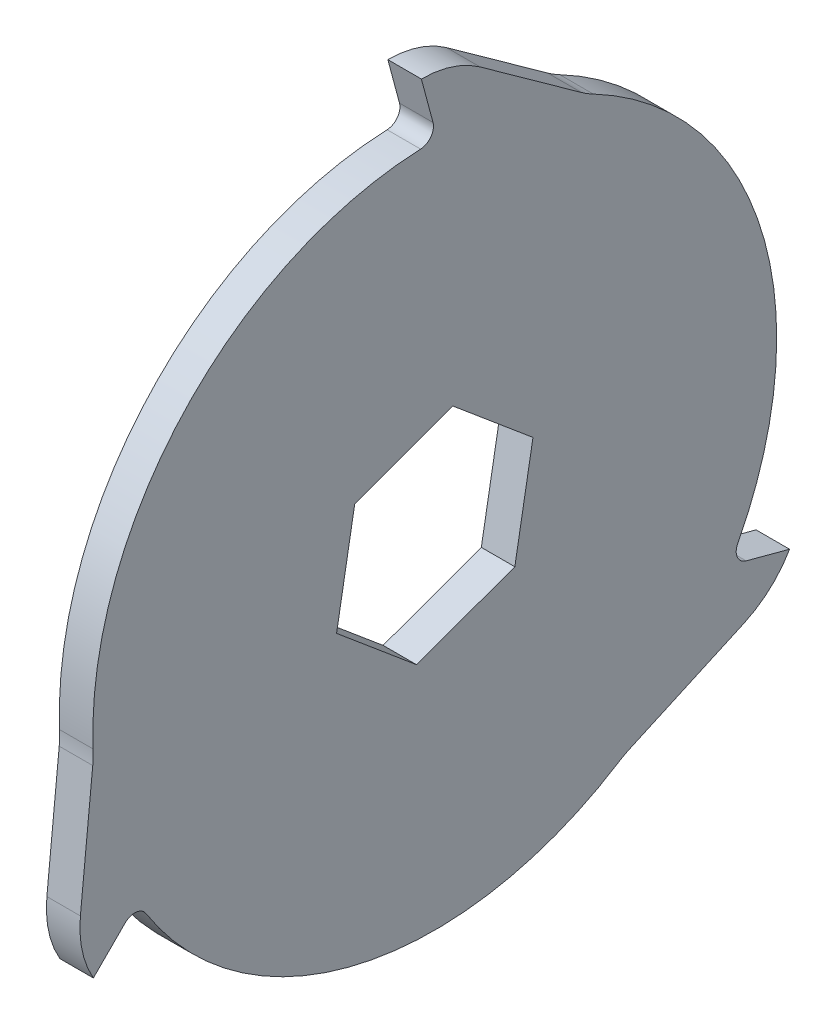
ISO-10303-21;
HEADER;
FILE_DESCRIPTION(('STEP AP214'),'2;1');
FILE_NAME('part.step','',(''),(''),'','','');
FILE_SCHEMA(('AUTOMOTIVE_DESIGN { 1 0 10303 214 1 1 1 1 }'));
ENDSEC;
DATA;
#1=APPLICATION_CONTEXT('core data for automotive mechanical design processes');
#2=APPLICATION_PROTOCOL_DEFINITION('international standard','automotive_design',2000,#1);
#3=PRODUCT_CONTEXT('',#1,'mechanical');
#4=PRODUCT('Part','Part','',(#3));
#5=PRODUCT_RELATED_PRODUCT_CATEGORY('part','',(#4));
#6=PRODUCT_DEFINITION_FORMATION('','',#4);
#7=PRODUCT_DEFINITION_CONTEXT('part definition',#1,'design');
#8=PRODUCT_DEFINITION('design','',#6,#7);
#9=PRODUCT_DEFINITION_SHAPE('','',#8);
#10=(LENGTH_UNIT() NAMED_UNIT(*) SI_UNIT(.MILLI.,.METRE.));
#11=(NAMED_UNIT(*) PLANE_ANGLE_UNIT() SI_UNIT($,.RADIAN.));
#12=(NAMED_UNIT(*) SI_UNIT($,.STERADIAN.) SOLID_ANGLE_UNIT());
#13=UNCERTAINTY_MEASURE_WITH_UNIT(LENGTH_MEASURE(1.E-05),#10,'distance_accuracy_value','');
#14=(GEOMETRIC_REPRESENTATION_CONTEXT(3) GLOBAL_UNCERTAINTY_ASSIGNED_CONTEXT((#13)) GLOBAL_UNIT_ASSIGNED_CONTEXT((#10,
#11,#12)) REPRESENTATION_CONTEXT('',''));
#15=CARTESIAN_POINT('',(0.,0.,0.));
#16=DIRECTION('',(0.,0.,1.));
#17=DIRECTION('',(1.,0.,0.));
#18=AXIS2_PLACEMENT_3D('',#15,#16,#17);
#19=CARTESIAN_POINT('',(2.5,0.,0.));
#20=DIRECTION('',(-1.,0.,0.));
#21=DIRECTION('',(0.,0.,1.));
#22=AXIS2_PLACEMENT_3D('',#19,#20,#21);
#23=CYLINDRICAL_SURFACE('',#22,51.);
#24=DIRECTION('',(1.,0.,0.));
#25=VECTOR('',#24,1.);
#26=CARTESIAN_POINT('',(-2.5,-23.6493995953492,-45.1852398331523));
#27=LINE('',#26,#25);
#28=CARTESIAN_POINT('',(-2.5,-23.6493995953492,-45.1852398331523));
#29=VERTEX_POINT('',#28);
#30=CARTESIAN_POINT('',(2.5,-23.6493995953492,-45.1852398331523));
#31=VERTEX_POINT('',#30);
#32=EDGE_CURVE('E248',#29,#31,#27,.T.);
#33=ORIENTED_EDGE('',*,*,#32,.F.);
#34=CARTESIAN_POINT('',(-2.5,0.,0.));
#35=DIRECTION('',(1.,0.,0.));
#36=DIRECTION('',(0.,0.,-1.));
#37=AXIS2_PLACEMENT_3D('',#34,#35,#36);
#38=CIRCLE('',#37,51.);
#39=CARTESIAN_POINT('',(-2.5,45.1852398331523,-23.6493995953494));
#40=VERTEX_POINT('',#39);
#41=EDGE_CURVE('E377',#29,#40,#38,.T.);
#42=ORIENTED_EDGE('',*,*,#41,.T.);
#43=DIRECTION('',(1.,0.,0.));
#44=VECTOR('',#43,1.);
#45=CARTESIAN_POINT('',(-2.5,45.1852398331523,-23.6493995953494));
#46=LINE('',#45,#44);
#47=CARTESIAN_POINT('',(2.5,45.1852398331523,-23.6493995953494));
#48=VERTEX_POINT('',#47);
#49=EDGE_CURVE('E326',#40,#48,#46,.T.);
#50=ORIENTED_EDGE('',*,*,#49,.T.);
#51=CARTESIAN_POINT('',(2.5,0.,0.));
#52=DIRECTION('',(1.,0.,0.));
#53=DIRECTION('',(0.,0.,-1.));
#54=AXIS2_PLACEMENT_3D('',#51,#52,#53);
#55=CIRCLE('',#54,51.);
#56=EDGE_CURVE('E43',#31,#48,#55,.T.);
#57=ORIENTED_EDGE('',*,*,#56,.F.);
#58=EDGE_LOOP('',(#33,#42,#50,#57));
#59=FACE_BOUND('',#58,.T.);
#60=ADVANCED_FACE('F33',(#59),#23,.T.);
#61=CARTESIAN_POINT('',(-2.5,-27.3068657739276,43.0736007503981));
#62=VERTEX_POINT('',#61);
#63=CARTESIAN_POINT('',(-2.5,-43.0736007503979,-27.3068657739281));
#64=VERTEX_POINT('',#63);
#65=EDGE_CURVE('E380',#62,#64,#38,.T.);
#66=ORIENTED_EDGE('',*,*,#65,.T.);
#67=DIRECTION('',(1.,0.,0.));
#68=VECTOR('',#67,1.);
#69=CARTESIAN_POINT('',(-2.5,-43.0736007503978,-27.3068657739281));
#70=LINE('',#69,#68);
#71=CARTESIAN_POINT('',(2.5,-43.0736007503979,-27.3068657739281));
#72=VERTEX_POINT('',#71);
#73=EDGE_CURVE('E57',#64,#72,#70,.T.);
#74=ORIENTED_EDGE('',*,*,#73,.T.);
#75=CARTESIAN_POINT('',(2.5,-27.3068657739276,43.0736007503981));
#76=VERTEX_POINT('',#75);
#77=EDGE_CURVE('E42',#76,#72,#55,.T.);
#78=ORIENTED_EDGE('',*,*,#77,.F.);
#79=DIRECTION('',(1.,0.,0.));
#80=VECTOR('',#79,1.);
#81=CARTESIAN_POINT('',(-2.5,-27.3068657739276,43.0736007503981));
#82=LINE('',#81,#80);
#83=EDGE_CURVE('E287',#62,#76,#82,.T.);
#84=ORIENTED_EDGE('',*,*,#83,.F.);
#85=EDGE_LOOP('',(#66,#74,#78,#84));
#86=FACE_BOUND('',#85,.T.);
#87=ADVANCED_FACE('F402',(#86),#23,.T.);
#88=CARTESIAN_POINT('',(2.5,0.,0.));
#89=DIRECTION('',(1.,0.,0.));
#90=DIRECTION('',(0.,0.,-1.));
#91=AXIS2_PLACEMENT_3D('',#88,#89,#90);
#92=PLANE('',#91);
#93=CARTESIAN_POINT('',(2.5,50.9562653692771,2.11163908275383));
#94=VERTEX_POINT('',#93);
#95=CARTESIAN_POINT('',(2.5,-2.11163908275438,50.9562653692771));
#96=VERTEX_POINT('',#95);
#97=EDGE_CURVE('E11',#94,#96,#55,.T.);
#98=ORIENTED_EDGE('',*,*,#97,.T.);
#99=CARTESIAN_POINT('',(2.5,-2.73270940121155,65.9434022425939));
#100=DIRECTION('',(-1.,0.,0.));
#101=DIRECTION('',(0.,0.866025403784436,0.500000000000004));
#102=AXIS2_PLACEMENT_3D('',#99,#100,#101);
#103=CIRCLE('',#102,15.);
#104=CARTESIAN_POINT('',(2.5,-4.21867035780101,51.0171863780322));
#105=VERTEX_POINT('',#104);
#106=EDGE_CURVE('E274',#96,#105,#103,.T.);
#107=ORIENTED_EDGE('',*,*,#106,.T.);
#108=DIRECTION('',(0.,-0.995081057637443,0.0990640637726305));
#109=VECTOR('',#108,1.);
#110=CARTESIAN_POINT('',(2.5,-4.21867035780101,51.0171863780322));
#111=LINE('',#110,#109);
#112=CARTESIAN_POINT('',(2.5,-22.7242225356181,52.8594837336301));
#113=VERTEX_POINT('',#112);
#114=EDGE_CURVE('E255',#105,#113,#111,.T.);
#115=ORIENTED_EDGE('',*,*,#114,.T.);
#116=CARTESIAN_POINT('',(2.5,-24.2101834922076,37.9332678690685));
#117=DIRECTION('',(1.,0.,0.));
#118=DIRECTION('',(0.,-0.866025403784436,-0.500000000000004));
#119=AXIS2_PLACEMENT_3D('',#116,#117,#118);
#120=CIRCLE('',#119,15.);
#121=CARTESIAN_POINT('',(2.5,-31.7101834922077,50.923648925835));
#122=VERTEX_POINT('',#121);
#123=EDGE_CURVE('E244',#113,#122,#120,.T.);
#124=ORIENTED_EDGE('',*,*,#123,.T.);
#125=DIRECTION('',(0.,0.707106781186546,-0.707106781186549));
#126=VECTOR('',#125,1.);
#127=CARTESIAN_POINT('',(2.5,-31.7101834922077,50.923648925835));
#128=LINE('',#127,#126);
#129=CARTESIAN_POINT('',(2.5,-26.963509692885,46.1769751265124));
#130=VERTEX_POINT('',#129);
#131=EDGE_CURVE('E269',#122,#130,#128,.T.);
#132=ORIENTED_EDGE('',*,*,#131,.T.);
#133=CARTESIAN_POINT('',(2.5,-28.3777232552581,44.7627615641393));
#134=DIRECTION('',(-1.,0.,0.));
#135=DIRECTION('',(0.,-0.866025403784436,-0.500000000000004));
#136=AXIS2_PLACEMENT_3D('',#133,#134,#135);
#137=CIRCLE('',#136,2.);
#138=EDGE_CURVE('E272',#130,#76,#137,.T.);
#139=ORIENTED_EDGE('',*,*,#138,.T.);
#140=ORIENTED_EDGE('',*,*,#77,.T.);
#141=CARTESIAN_POINT('',(2.5,-55.742306853456,-35.3382968839069));
#142=DIRECTION('',(-1.,0.,0.));
#143=DIRECTION('',(0.,-0.866025403784443,0.499999999999992));
#144=AXIS2_PLACEMENT_3D('',#141,#142,#143);
#145=CIRCLE('',#144,15.);
#146=CARTESIAN_POINT('',(2.5,-42.0728442540807,-29.1620688890644));
#147=VERTEX_POINT('',#146);
#148=EDGE_CURVE('E227',#72,#147,#145,.T.);
#149=ORIENTED_EDGE('',*,*,#148,.T.);
#150=DIRECTION('',(0.,0.411748532989506,-0.911297506625026));
#151=VECTOR('',#150,1.);
#152=CARTESIAN_POINT('',(2.5,-42.0728442540807,-29.1620688890644));
#153=LINE('',#152,#151);
#154=CARTESIAN_POINT('',(2.5,-34.4155444764447,-46.1094958639113));
#155=VERTEX_POINT('',#154);
#156=EDGE_CURVE('E224',#147,#155,#153,.T.);
#157=ORIENTED_EDGE('',*,*,#156,.T.);
#158=CARTESIAN_POINT('',(2.5,-20.7460818770693,-39.9332678690688));
#159=DIRECTION('',(1.,0.,0.));
#160=DIRECTION('',(0.,0.866025403784443,-0.499999999999992));
#161=AXIS2_PLACEMENT_3D('',#158,#159,#160);
#162=CIRCLE('',#161,15.);
#163=CARTESIAN_POINT('',(2.5,-28.2460818770692,-52.9236489258354));
#164=VERTEX_POINT('',#163);
#165=EDGE_CURVE('E235',#155,#164,#162,.T.);
#166=ORIENTED_EDGE('',*,*,#165,.T.);
#167=DIRECTION('',(0.,0.258819045102518,0.965925826289069));
#168=VECTOR('',#167,1.);
#169=CARTESIAN_POINT('',(2.5,-28.2460818770692,-52.9236489258354));
#170=LINE('',#169,#168);
#171=CARTESIAN_POINT('',(2.5,-26.5086786830391,-46.4395719324827));
#172=VERTEX_POINT('',#171);
#173=EDGE_CURVE('E202',#164,#172,#170,.T.);
#174=ORIENTED_EDGE('',*,*,#173,.T.);
#175=CARTESIAN_POINT('',(2.5,-24.576827030461,-46.9572100226877));
#176=DIRECTION('',(-1.,0.,0.));
#177=DIRECTION('',(0.,0.866025403784443,-0.499999999999992));
#178=AXIS2_PLACEMENT_3D('',#175,#176,#177);
#179=CIRCLE('',#178,2.);
#180=EDGE_CURVE('E238',#172,#31,#179,.T.);
#181=ORIENTED_EDGE('',*,*,#180,.T.);
#182=ORIENTED_EDGE('',*,*,#56,.T.);
#183=CARTESIAN_POINT('',(2.5,58.4750162546676,-30.6051053586874));
#184=DIRECTION('',(-1.,0.,0.));
#185=DIRECTION('',(0.,0.,-1.));
#186=AXIS2_PLACEMENT_3D('',#183,#184,#185);
#187=CIRCLE('',#186,15.);
#188=CARTESIAN_POINT('',(2.5,46.2915146118817,-21.8551174889682));
#189=VERTEX_POINT('',#188);
#190=EDGE_CURVE('E316',#48,#189,#187,.T.);
#191=ORIENTED_EDGE('',*,*,#190,.T.);
#192=DIRECTION('',(0.,0.583332524647945,0.812233442852395));
#193=VECTOR('',#192,1.);
#194=CARTESIAN_POINT('',(2.5,46.2915146118817,-21.8551174889682));
#195=LINE('',#194,#193);
#196=CARTESIAN_POINT('',(2.5,57.139767012063,-6.74998786971917));
#197=VERTEX_POINT('',#196);
#198=EDGE_CURVE('E297',#189,#197,#195,.T.);
#199=ORIENTED_EDGE('',*,*,#198,.T.);
#200=CARTESIAN_POINT('',(2.5,44.9562653692771,2.));
#201=DIRECTION('',(1.,0.,0.));
#202=DIRECTION('',(0.,0.,1.));
#203=AXIS2_PLACEMENT_3D('',#200,#201,#202);
#204=CIRCLE('',#203,15.);
#205=CARTESIAN_POINT('',(2.5,59.9562653692771,2.));
#206=VERTEX_POINT('',#205);
#207=EDGE_CURVE('E281',#197,#206,#204,.T.);
#208=ORIENTED_EDGE('',*,*,#207,.T.);
#209=DIRECTION('',(0.,-0.96592582628907,-0.258819045102514));
#210=VECTOR('',#209,1.);
#211=CARTESIAN_POINT('',(2.5,59.9562653692771,2.));
#212=LINE('',#211,#210);
#213=CARTESIAN_POINT('',(2.5,53.4721883759244,0.262596805969956));
#214=VERTEX_POINT('',#213);
#215=EDGE_CURVE('E311',#206,#214,#212,.T.);
#216=ORIENTED_EDGE('',*,*,#215,.T.);
#217=CARTESIAN_POINT('',(2.5,52.9545502857193,2.1944484585481));
#218=DIRECTION('',(-1.,0.,0.));
#219=DIRECTION('',(0.,0.,1.));
#220=AXIS2_PLACEMENT_3D('',#217,#218,#219);
#221=CIRCLE('',#220,2.);
#222=EDGE_CURVE('E314',#214,#94,#221,.T.);
#223=ORIENTED_EDGE('',*,*,#222,.T.);
#224=EDGE_LOOP('',(#98,#107,#115,#124,#132,#139,#140,#149,#157,#166,#174,#181,#182,#191,#199,
#208,#216,#223));
#225=FACE_BOUND('',#224,.T.);
#226=DIRECTION('',(0.,0.642787609686535,0.766044443118981));
#227=VECTOR('',#226,1.);
#228=CARTESIAN_POINT('',(2.5,5.33156638906851,-14.6483582642887));
#229=LINE('',#228,#227);
#230=CARTESIAN_POINT('',(2.5,5.33156638906851,-14.6483582642887));
#231=VERTEX_POINT('',#230);
#232=CARTESIAN_POINT('',(2.5,15.351633575144,-2.70690719724775));
#233=VERTEX_POINT('',#232);
#234=EDGE_CURVE('E336',#231,#233,#229,.T.);
#235=ORIENTED_EDGE('',*,*,#234,.F.);
#236=DIRECTION('',(0.,0.984807753012209,-0.173648177666925));
#237=VECTOR('',#236,1.);
#238=CARTESIAN_POINT('',(2.5,-10.0200671860755,-11.9414510670409));
#239=LINE('',#238,#237);
#240=CARTESIAN_POINT('',(2.5,-10.0200671860755,-11.9414510670409));
#241=VERTEX_POINT('',#240);
#242=EDGE_CURVE('E334',#241,#231,#239,.T.);
#243=ORIENTED_EDGE('',*,*,#242,.F.);
#244=DIRECTION('',(0.,0.342020143325674,-0.939692620785907));
#245=VECTOR('',#244,1.);
#246=CARTESIAN_POINT('',(2.5,-15.351633575144,2.70690719724775));
#247=LINE('',#246,#245);
#248=CARTESIAN_POINT('',(2.5,-15.351633575144,2.70690719724775));
#249=VERTEX_POINT('',#248);
#250=EDGE_CURVE('E346',#249,#241,#247,.T.);
#251=ORIENTED_EDGE('',*,*,#250,.F.);
#252=DIRECTION('',(0.,-0.642787609686535,-0.766044443118981));
#253=VECTOR('',#252,1.);
#254=CARTESIAN_POINT('',(2.5,-5.33156638906851,14.6483582642887));
#255=LINE('',#254,#253);
#256=CARTESIAN_POINT('',(2.5,-5.33156638906851,14.6483582642887));
#257=VERTEX_POINT('',#256);
#258=EDGE_CURVE('E343',#257,#249,#255,.T.);
#259=ORIENTED_EDGE('',*,*,#258,.F.);
#260=DIRECTION('',(0.,-0.984807753012209,0.173648177666925));
#261=VECTOR('',#260,1.);
#262=CARTESIAN_POINT('',(2.5,10.0200671860755,11.9414510670409));
#263=LINE('',#262,#261);
#264=CARTESIAN_POINT('',(2.5,10.0200671860755,11.9414510670409));
#265=VERTEX_POINT('',#264);
#266=EDGE_CURVE('E341',#265,#257,#263,.T.);
#267=ORIENTED_EDGE('',*,*,#266,.F.);
#268=DIRECTION('',(0.,-0.342020143325674,0.939692620785906));
#269=VECTOR('',#268,1.);
#270=CARTESIAN_POINT('',(2.5,15.351633575144,-2.70690719724775));
#271=LINE('',#270,#269);
#272=EDGE_CURVE('E339',#233,#265,#271,.T.);
#273=ORIENTED_EDGE('',*,*,#272,.F.);
#274=EDGE_LOOP('',(#235,#243,#251,#259,#267,#273));
#275=FACE_BOUND('',#274,.T.);
#276=ADVANCED_FACE('F388',(#225,#275),#92,.T.);
#277=CARTESIAN_POINT('',(-2.5,0.,0.));
#278=DIRECTION('',(1.,0.,0.));
#279=DIRECTION('',(0.,0.,-1.));
#280=AXIS2_PLACEMENT_3D('',#277,#278,#279);
#281=PLANE('',#280);
#282=CARTESIAN_POINT('',(-2.5,50.9562653692771,2.11163908275383));
#283=VERTEX_POINT('',#282);
#284=CARTESIAN_POINT('',(-2.5,-2.11163908275438,50.9562653692771));
#285=VERTEX_POINT('',#284);
#286=EDGE_CURVE('E37',#283,#285,#38,.T.);
#287=ORIENTED_EDGE('',*,*,#286,.F.);
#288=CARTESIAN_POINT('',(-2.5,52.9545502857193,2.1944484585481));
#289=DIRECTION('',(-1.,0.,0.));
#290=DIRECTION('',(0.,0.,1.));
#291=AXIS2_PLACEMENT_3D('',#288,#289,#290);
#292=CIRCLE('',#291,2.);
#293=CARTESIAN_POINT('',(-2.5,53.4721883759244,0.262596805969956));
#294=VERTEX_POINT('',#293);
#295=EDGE_CURVE('E300',#294,#283,#292,.T.);
#296=ORIENTED_EDGE('',*,*,#295,.F.);
#297=DIRECTION('',(0.,-0.96592582628907,-0.258819045102514));
#298=VECTOR('',#297,1.);
#299=CARTESIAN_POINT('',(-2.5,59.9562653692771,2.));
#300=LINE('',#299,#298);
#301=CARTESIAN_POINT('',(-2.5,59.9562653692771,2.));
#302=VERTEX_POINT('',#301);
#303=EDGE_CURVE('E296',#302,#294,#300,.T.);
#304=ORIENTED_EDGE('',*,*,#303,.F.);
#305=CARTESIAN_POINT('',(-2.5,44.9562653692771,2.));
#306=DIRECTION('',(1.,0.,0.));
#307=DIRECTION('',(0.,0.,1.));
#308=AXIS2_PLACEMENT_3D('',#305,#306,#307);
#309=CIRCLE('',#308,15.);
#310=CARTESIAN_POINT('',(-2.5,57.139767012063,-6.74998786971917));
#311=VERTEX_POINT('',#310);
#312=EDGE_CURVE('E293',#311,#302,#309,.T.);
#313=ORIENTED_EDGE('',*,*,#312,.F.);
#314=DIRECTION('',(0.,0.583332524647945,0.812233442852395));
#315=VECTOR('',#314,1.);
#316=CARTESIAN_POINT('',(-2.5,46.2915146118817,-21.8551174889682));
#317=LINE('',#316,#315);
#318=CARTESIAN_POINT('',(-2.5,46.2915146118817,-21.8551174889682));
#319=VERTEX_POINT('',#318);
#320=EDGE_CURVE('E305',#319,#311,#317,.T.);
#321=ORIENTED_EDGE('',*,*,#320,.F.);
#322=CARTESIAN_POINT('',(-2.5,58.4750162546676,-30.6051053586874));
#323=DIRECTION('',(-1.,0.,0.));
#324=DIRECTION('',(0.,0.,-1.));
#325=AXIS2_PLACEMENT_3D('',#322,#323,#324);
#326=CIRCLE('',#325,15.);
#327=EDGE_CURVE('E302',#40,#319,#326,.T.);
#328=ORIENTED_EDGE('',*,*,#327,.F.);
#329=ORIENTED_EDGE('',*,*,#41,.F.);
#330=CARTESIAN_POINT('',(-2.5,-24.576827030461,-46.9572100226877));
#331=DIRECTION('',(-1.,0.,0.));
#332=DIRECTION('',(0.,0.866025403784443,-0.499999999999992));
#333=AXIS2_PLACEMENT_3D('',#330,#331,#332);
#334=CIRCLE('',#333,2.);
#335=CARTESIAN_POINT('',(-2.5,-26.5086786830391,-46.4395719324827));
#336=VERTEX_POINT('',#335);
#337=EDGE_CURVE('E220',#336,#29,#334,.T.);
#338=ORIENTED_EDGE('',*,*,#337,.F.);
#339=DIRECTION('',(0.,0.258819045102518,0.965925826289069));
#340=VECTOR('',#339,1.);
#341=CARTESIAN_POINT('',(-2.5,-28.2460818770692,-52.9236489258354));
#342=LINE('',#341,#340);
#343=CARTESIAN_POINT('',(-2.5,-28.2460818770692,-52.9236489258354));
#344=VERTEX_POINT('',#343);
#345=EDGE_CURVE('E200',#344,#336,#342,.T.);
#346=ORIENTED_EDGE('',*,*,#345,.F.);
#347=CARTESIAN_POINT('',(-2.5,-20.7460818770693,-39.9332678690688));
#348=DIRECTION('',(1.,0.,0.));
#349=DIRECTION('',(0.,0.866025403784443,-0.499999999999992));
#350=AXIS2_PLACEMENT_3D('',#347,#348,#349);
#351=CIRCLE('',#350,15.);
#352=CARTESIAN_POINT('',(-2.5,-34.4155444764447,-46.1094958639113));
#353=VERTEX_POINT('',#352);
#354=EDGE_CURVE('E217',#353,#344,#351,.T.);
#355=ORIENTED_EDGE('',*,*,#354,.F.);
#356=DIRECTION('',(0.,0.411748532989506,-0.911297506625026));
#357=VECTOR('',#356,1.);
#358=CARTESIAN_POINT('',(-2.5,-42.0728442540807,-29.1620688890644));
#359=LINE('',#358,#357);
#360=CARTESIAN_POINT('',(-2.5,-42.0728442540807,-29.1620688890644));
#361=VERTEX_POINT('',#360);
#362=EDGE_CURVE('E208',#361,#353,#359,.T.);
#363=ORIENTED_EDGE('',*,*,#362,.F.);
#364=CARTESIAN_POINT('',(-2.5,-55.742306853456,-35.3382968839069));
#365=DIRECTION('',(-1.,0.,0.));
#366=DIRECTION('',(0.,-0.866025403784443,0.499999999999992));
#367=AXIS2_PLACEMENT_3D('',#364,#365,#366);
#368=CIRCLE('',#367,15.);
#369=EDGE_CURVE('E231',#64,#361,#368,.T.);
#370=ORIENTED_EDGE('',*,*,#369,.F.);
#371=ORIENTED_EDGE('',*,*,#65,.F.);
#372=CARTESIAN_POINT('',(-2.5,-28.3777232552581,44.7627615641393));
#373=DIRECTION('',(-1.,0.,0.));
#374=DIRECTION('',(0.,-0.866025403784436,-0.500000000000004));
#375=AXIS2_PLACEMENT_3D('',#372,#373,#374);
#376=CIRCLE('',#375,2.);
#377=CARTESIAN_POINT('',(-2.5,-26.963509692885,46.1769751265124));
#378=VERTEX_POINT('',#377);
#379=EDGE_CURVE('E258',#378,#62,#376,.T.);
#380=ORIENTED_EDGE('',*,*,#379,.F.);
#381=DIRECTION('',(0.,0.707106781186546,-0.707106781186549));
#382=VECTOR('',#381,1.);
#383=CARTESIAN_POINT('',(-2.5,-31.7101834922077,50.923648925835));
#384=LINE('',#383,#382);
#385=CARTESIAN_POINT('',(-2.5,-31.7101834922077,50.923648925835));
#386=VERTEX_POINT('',#385);
#387=EDGE_CURVE('E254',#386,#378,#384,.T.);
#388=ORIENTED_EDGE('',*,*,#387,.F.);
#389=CARTESIAN_POINT('',(-2.5,-24.2101834922076,37.9332678690685));
#390=DIRECTION('',(1.,0.,0.));
#391=DIRECTION('',(0.,-0.866025403784436,-0.500000000000004));
#392=AXIS2_PLACEMENT_3D('',#389,#390,#391);
#393=CIRCLE('',#392,15.);
#394=CARTESIAN_POINT('',(-2.5,-22.7242225356181,52.8594837336301));
#395=VERTEX_POINT('',#394);
#396=EDGE_CURVE('E251',#395,#386,#393,.T.);
#397=ORIENTED_EDGE('',*,*,#396,.F.);
#398=DIRECTION('',(0.,-0.995081057637443,0.0990640637726305));
#399=VECTOR('',#398,1.);
#400=CARTESIAN_POINT('',(-2.5,-4.21867035780101,51.0171863780322));
#401=LINE('',#400,#399);
#402=CARTESIAN_POINT('',(-2.5,-4.21867035780101,51.0171863780322));
#403=VERTEX_POINT('',#402);
#404=EDGE_CURVE('E263',#403,#395,#401,.T.);
#405=ORIENTED_EDGE('',*,*,#404,.F.);
#406=CARTESIAN_POINT('',(-2.5,-2.73270940121155,65.9434022425939));
#407=DIRECTION('',(-1.,0.,0.));
#408=DIRECTION('',(0.,0.866025403784436,0.500000000000004));
#409=AXIS2_PLACEMENT_3D('',#406,#407,#408);
#410=CIRCLE('',#409,15.);
#411=EDGE_CURVE('E260',#285,#403,#410,.T.);
#412=ORIENTED_EDGE('',*,*,#411,.F.);
#413=EDGE_LOOP('',(#287,#296,#304,#313,#321,#328,#329,#338,#346,#355,#363,#370,#371,#380,#388,
#397,#405,#412));
#414=FACE_BOUND('',#413,.T.);
#415=DIRECTION('',(0.,0.984807753012209,-0.173648177666925));
#416=VECTOR('',#415,1.);
#417=CARTESIAN_POINT('',(-2.5,-10.0200671860755,-11.9414510670409));
#418=LINE('',#417,#416);
#419=CARTESIAN_POINT('',(-2.5,-10.0200671860755,-11.9414510670409));
#420=VERTEX_POINT('',#419);
#421=CARTESIAN_POINT('',(-2.5,5.33156638906851,-14.6483582642887));
#422=VERTEX_POINT('',#421);
#423=EDGE_CURVE('E323',#420,#422,#418,.T.);
#424=ORIENTED_EDGE('',*,*,#423,.T.);
#425=DIRECTION('',(0.,0.642787609686535,0.766044443118981));
#426=VECTOR('',#425,1.);
#427=CARTESIAN_POINT('',(-2.5,5.33156638906851,-14.6483582642887));
#428=LINE('',#427,#426);
#429=CARTESIAN_POINT('',(-2.5,15.351633575144,-2.70690719724775));
#430=VERTEX_POINT('',#429);
#431=EDGE_CURVE('E351',#422,#430,#428,.T.);
#432=ORIENTED_EDGE('',*,*,#431,.T.);
#433=DIRECTION('',(0.,-0.342020143325674,0.939692620785906));
#434=VECTOR('',#433,1.);
#435=CARTESIAN_POINT('',(-2.5,15.351633575144,-2.70690719724775));
#436=LINE('',#435,#434);
#437=CARTESIAN_POINT('',(-2.5,10.0200671860755,11.9414510670409));
#438=VERTEX_POINT('',#437);
#439=EDGE_CURVE('E354',#430,#438,#436,.T.);
#440=ORIENTED_EDGE('',*,*,#439,.T.);
#441=DIRECTION('',(0.,-0.984807753012209,0.173648177666925));
#442=VECTOR('',#441,1.);
#443=CARTESIAN_POINT('',(-2.5,10.0200671860755,11.9414510670409));
#444=LINE('',#443,#442);
#445=CARTESIAN_POINT('',(-2.5,-5.33156638906851,14.6483582642887));
#446=VERTEX_POINT('',#445);
#447=EDGE_CURVE('E357',#438,#446,#444,.T.);
#448=ORIENTED_EDGE('',*,*,#447,.T.);
#449=DIRECTION('',(0.,-0.642787609686535,-0.766044443118981));
#450=VECTOR('',#449,1.);
#451=CARTESIAN_POINT('',(-2.5,-5.33156638906851,14.6483582642887));
#452=LINE('',#451,#450);
#453=CARTESIAN_POINT('',(-2.5,-15.351633575144,2.70690719724775));
#454=VERTEX_POINT('',#453);
#455=EDGE_CURVE('E360',#446,#454,#452,.T.);
#456=ORIENTED_EDGE('',*,*,#455,.T.);
#457=DIRECTION('',(0.,0.342020143325674,-0.939692620785907));
#458=VECTOR('',#457,1.);
#459=CARTESIAN_POINT('',(-2.5,-15.351633575144,2.70690719724775));
#460=LINE('',#459,#458);
#461=EDGE_CURVE('E337',#454,#420,#460,.T.);
#462=ORIENTED_EDGE('',*,*,#461,.T.);
#463=EDGE_LOOP('',(#424,#432,#440,#448,#456,#462));
#464=FACE_BOUND('',#463,.T.);
#465=ADVANCED_FACE('F214',(#414,#464),#281,.F.);
#466=ORIENTED_EDGE('',*,*,#286,.T.);
#467=DIRECTION('',(1.,0.,0.));
#468=VECTOR('',#467,1.);
#469=CARTESIAN_POINT('',(-2.5,-2.11163908275438,50.9562653692771));
#470=LINE('',#469,#468);
#471=EDGE_CURVE('E284',#285,#96,#470,.T.);
#472=ORIENTED_EDGE('',*,*,#471,.T.);
#473=ORIENTED_EDGE('',*,*,#97,.F.);
#474=DIRECTION('',(1.,0.,0.));
#475=VECTOR('',#474,1.);
#476=CARTESIAN_POINT('',(-2.5,50.9562653692771,2.11163908275383));
#477=LINE('',#476,#475);
#478=EDGE_CURVE('E328',#283,#94,#477,.T.);
#479=ORIENTED_EDGE('',*,*,#478,.F.);
#480=EDGE_LOOP('',(#466,#472,#473,#479));
#481=FACE_BOUND('',#480,.T.);
#482=ADVANCED_FACE('F35',(#481),#23,.T.);
#483=CARTESIAN_POINT('',(2.5,-10.0200671860755,-11.9414510670409));
#484=DIRECTION('',(0.,0.173648177666925,0.984807753012209));
#485=DIRECTION('',(0.,-0.984807753012209,0.173648177666925));
#486=AXIS2_PLACEMENT_3D('',#483,#484,#485);
#487=PLANE('',#486);
#488=ORIENTED_EDGE('',*,*,#423,.F.);
#489=DIRECTION('',(-1.,0.,0.));
#490=VECTOR('',#489,1.);
#491=CARTESIAN_POINT('',(2.5,-10.0200671860755,-11.9414510670409));
#492=LINE('',#491,#490);
#493=EDGE_CURVE('E348',#241,#420,#492,.T.);
#494=ORIENTED_EDGE('',*,*,#493,.F.);
#495=ORIENTED_EDGE('',*,*,#242,.T.);
#496=DIRECTION('',(-1.,0.,0.));
#497=VECTOR('',#496,1.);
#498=CARTESIAN_POINT('',(2.5,5.33156638906851,-14.6483582642887));
#499=LINE('',#498,#497);
#500=EDGE_CURVE('E375',#231,#422,#499,.T.);
#501=ORIENTED_EDGE('',*,*,#500,.T.);
#502=EDGE_LOOP('',(#488,#494,#495,#501));
#503=FACE_BOUND('',#502,.T.);
#504=ADVANCED_FACE('F407',(#503),#487,.T.);
#505=CARTESIAN_POINT('',(2.5,5.33156638906851,-14.6483582642887));
#506=DIRECTION('',(0.,-0.766044443118981,0.642787609686535));
#507=DIRECTION('',(0.,-0.642787609686535,-0.766044443118982));
#508=AXIS2_PLACEMENT_3D('',#505,#506,#507);
#509=PLANE('',#508);
#510=ORIENTED_EDGE('',*,*,#431,.F.);
#511=ORIENTED_EDGE('',*,*,#500,.F.);
#512=ORIENTED_EDGE('',*,*,#234,.T.);
#513=DIRECTION('',(-1.,0.,0.));
#514=VECTOR('',#513,1.);
#515=CARTESIAN_POINT('',(2.5,15.351633575144,-2.70690719724775));
#516=LINE('',#515,#514);
#517=EDGE_CURVE('E373',#233,#430,#516,.T.);
#518=ORIENTED_EDGE('',*,*,#517,.T.);
#519=EDGE_LOOP('',(#510,#511,#512,#518));
#520=FACE_BOUND('',#519,.T.);
#521=ADVANCED_FACE('F412',(#520),#509,.T.);
#522=CARTESIAN_POINT('',(2.5,15.351633575144,-2.70690719724775));
#523=DIRECTION('',(0.,-0.939692620785907,-0.342020143325674));
#524=DIRECTION('',(0.,0.342020143325674,-0.939692620785907));
#525=AXIS2_PLACEMENT_3D('',#522,#523,#524);
#526=PLANE('',#525);
#527=ORIENTED_EDGE('',*,*,#439,.F.);
#528=ORIENTED_EDGE('',*,*,#517,.F.);
#529=ORIENTED_EDGE('',*,*,#272,.T.);
#530=DIRECTION('',(-1.,0.,0.));
#531=VECTOR('',#530,1.);
#532=CARTESIAN_POINT('',(2.5,10.0200671860755,11.9414510670409));
#533=LINE('',#532,#531);
#534=EDGE_CURVE('E371',#265,#438,#533,.T.);
#535=ORIENTED_EDGE('',*,*,#534,.T.);
#536=EDGE_LOOP('',(#527,#528,#529,#535));
#537=FACE_BOUND('',#536,.T.);
#538=ADVANCED_FACE('F421',(#537),#526,.T.);
#539=CARTESIAN_POINT('',(2.5,10.0200671860755,11.9414510670409));
#540=DIRECTION('',(0.,-0.173648177666925,-0.984807753012209));
#541=DIRECTION('',(0.,0.984807753012209,-0.173648177666925));
#542=AXIS2_PLACEMENT_3D('',#539,#540,#541);
#543=PLANE('',#542);
#544=ORIENTED_EDGE('',*,*,#447,.F.);
#545=ORIENTED_EDGE('',*,*,#534,.F.);
#546=ORIENTED_EDGE('',*,*,#266,.T.);
#547=DIRECTION('',(-1.,0.,0.));
#548=VECTOR('',#547,1.);
#549=CARTESIAN_POINT('',(2.5,-5.33156638906851,14.6483582642887));
#550=LINE('',#549,#548);
#551=EDGE_CURVE('E369',#257,#446,#550,.T.);
#552=ORIENTED_EDGE('',*,*,#551,.T.);
#553=EDGE_LOOP('',(#544,#545,#546,#552));
#554=FACE_BOUND('',#553,.T.);
#555=ADVANCED_FACE('F425',(#554),#543,.T.);
#556=CARTESIAN_POINT('',(2.5,-5.33156638906851,14.6483582642887));
#557=DIRECTION('',(0.,0.766044443118981,-0.642787609686535));
#558=DIRECTION('',(0.,0.642787609686535,0.766044443118981));
#559=AXIS2_PLACEMENT_3D('',#556,#557,#558);
#560=PLANE('',#559);
#561=ORIENTED_EDGE('',*,*,#455,.F.);
#562=ORIENTED_EDGE('',*,*,#551,.F.);
#563=ORIENTED_EDGE('',*,*,#258,.T.);
#564=DIRECTION('',(-1.,0.,0.));
#565=VECTOR('',#564,1.);
#566=CARTESIAN_POINT('',(2.5,-15.351633575144,2.70690719724775));
#567=LINE('',#566,#565);
#568=EDGE_CURVE('E367',#249,#454,#567,.T.);
#569=ORIENTED_EDGE('',*,*,#568,.T.);
#570=EDGE_LOOP('',(#561,#562,#563,#569));
#571=FACE_BOUND('',#570,.T.);
#572=ADVANCED_FACE('F429',(#571),#560,.T.);
#573=CARTESIAN_POINT('',(2.5,-15.351633575144,2.70690719724775));
#574=DIRECTION('',(0.,0.939692620785907,0.342020143325674));
#575=DIRECTION('',(0.,-0.342020143325674,0.939692620785907));
#576=AXIS2_PLACEMENT_3D('',#573,#574,#575);
#577=PLANE('',#576);
#578=ORIENTED_EDGE('',*,*,#461,.F.);
#579=ORIENTED_EDGE('',*,*,#568,.F.);
#580=ORIENTED_EDGE('',*,*,#250,.T.);
#581=ORIENTED_EDGE('',*,*,#493,.T.);
#582=EDGE_LOOP('',(#578,#579,#580,#581));
#583=FACE_BOUND('',#582,.T.);
#584=ADVANCED_FACE('F433',(#583),#577,.T.);
#585=CARTESIAN_POINT('',(-2.5,44.9562653692771,2.));
#586=DIRECTION('',(1.,0.,0.));
#587=DIRECTION('',(0.,0.,-1.));
#588=AXIS2_PLACEMENT_3D('',#585,#586,#587);
#589=CYLINDRICAL_SURFACE('',#588,15.);
#590=ORIENTED_EDGE('',*,*,#207,.F.);
#591=DIRECTION('',(1.,0.,0.));
#592=VECTOR('',#591,1.);
#593=CARTESIAN_POINT('',(-2.5,57.139767012063,-6.74998786971917));
#594=LINE('',#593,#592);
#595=EDGE_CURVE('E321',#311,#197,#594,.T.);
#596=ORIENTED_EDGE('',*,*,#595,.F.);
#597=ORIENTED_EDGE('',*,*,#312,.T.);
#598=DIRECTION('',(1.,0.,0.));
#599=VECTOR('',#598,1.);
#600=CARTESIAN_POINT('',(-2.5,59.9562653692771,2.));
#601=LINE('',#600,#599);
#602=EDGE_CURVE('E308',#302,#206,#601,.T.);
#603=ORIENTED_EDGE('',*,*,#602,.T.);
#604=EDGE_LOOP('',(#590,#596,#597,#603));
#605=FACE_BOUND('',#604,.T.);
#606=ADVANCED_FACE('F437',(#605),#589,.T.);
#607=CARTESIAN_POINT('',(-2.5,46.2915146118817,-21.8551174889682));
#608=DIRECTION('',(0.,0.812233442852395,-0.583332524647945));
#609=DIRECTION('',(0.,0.583332524647945,0.812233442852395));
#610=AXIS2_PLACEMENT_3D('',#607,#608,#609);
#611=PLANE('',#610);
#612=ORIENTED_EDGE('',*,*,#198,.F.);
#613=DIRECTION('',(1.,0.,0.));
#614=VECTOR('',#613,1.);
#615=CARTESIAN_POINT('',(-2.5,46.2915146118817,-21.8551174889682));
#616=LINE('',#615,#614);
#617=EDGE_CURVE('E324',#319,#189,#616,.T.);
#618=ORIENTED_EDGE('',*,*,#617,.F.);
#619=ORIENTED_EDGE('',*,*,#320,.T.);
#620=ORIENTED_EDGE('',*,*,#595,.T.);
#621=EDGE_LOOP('',(#612,#618,#619,#620));
#622=FACE_BOUND('',#621,.T.);
#623=ADVANCED_FACE('F441',(#622),#611,.T.);
#624=CARTESIAN_POINT('',(-2.5,58.4750162546676,-30.6051053586874));
#625=DIRECTION('',(1.,0.,0.));
#626=DIRECTION('',(0.,0.,-1.));
#627=AXIS2_PLACEMENT_3D('',#624,#625,#626);
#628=CYLINDRICAL_SURFACE('',#627,15.);
#629=ORIENTED_EDGE('',*,*,#190,.F.);
#630=ORIENTED_EDGE('',*,*,#49,.F.);
#631=ORIENTED_EDGE('',*,*,#327,.T.);
#632=ORIENTED_EDGE('',*,*,#617,.T.);
#633=EDGE_LOOP('',(#629,#630,#631,#632));
#634=FACE_BOUND('',#633,.T.);
#635=ADVANCED_FACE('F451',(#634),#628,.F.);
#636=CARTESIAN_POINT('',(-2.5,52.9545502857193,2.1944484585481));
#637=DIRECTION('',(1.,0.,0.));
#638=DIRECTION('',(0.,0.,-1.));
#639=AXIS2_PLACEMENT_3D('',#636,#637,#638);
#640=CYLINDRICAL_SURFACE('',#639,2.);
#641=ORIENTED_EDGE('',*,*,#222,.F.);
#642=DIRECTION('',(1.,0.,0.));
#643=VECTOR('',#642,1.);
#644=CARTESIAN_POINT('',(-2.5,53.4721883759244,0.262596805969956));
#645=LINE('',#644,#643);
#646=EDGE_CURVE('E331',#294,#214,#645,.T.);
#647=ORIENTED_EDGE('',*,*,#646,.F.);
#648=ORIENTED_EDGE('',*,*,#295,.T.);
#649=ORIENTED_EDGE('',*,*,#478,.T.);
#650=EDGE_LOOP('',(#641,#647,#648,#649));
#651=FACE_BOUND('',#650,.T.);
#652=ADVANCED_FACE('F447',(#651),#640,.F.);
#653=CARTESIAN_POINT('',(-2.5,59.9562653692771,2.));
#654=DIRECTION('',(0.,-0.258819045102514,0.96592582628907));
#655=DIRECTION('',(0.,-0.96592582628907,-0.258819045102514));
#656=AXIS2_PLACEMENT_3D('',#653,#654,#655);
#657=PLANE('',#656);
#658=ORIENTED_EDGE('',*,*,#215,.F.);
#659=ORIENTED_EDGE('',*,*,#602,.F.);
#660=ORIENTED_EDGE('',*,*,#303,.T.);
#661=ORIENTED_EDGE('',*,*,#646,.T.);
#662=EDGE_LOOP('',(#658,#659,#660,#661));
#663=FACE_BOUND('',#662,.T.);
#664=ADVANCED_FACE('F443',(#663),#657,.T.);
#665=CARTESIAN_POINT('',(-2.5,-24.2101834922076,37.9332678690685));
#666=DIRECTION('',(1.,0.,0.));
#667=DIRECTION('',(0.,0.,-1.));
#668=AXIS2_PLACEMENT_3D('',#665,#666,#667);
#669=CYLINDRICAL_SURFACE('',#668,15.);
#670=ORIENTED_EDGE('',*,*,#123,.F.);
#671=DIRECTION('',(1.,0.,0.));
#672=VECTOR('',#671,1.);
#673=CARTESIAN_POINT('',(-2.5,-22.7242225356181,52.8594837336301));
#674=LINE('',#673,#672);
#675=EDGE_CURVE('E279',#395,#113,#674,.T.);
#676=ORIENTED_EDGE('',*,*,#675,.F.);
#677=ORIENTED_EDGE('',*,*,#396,.T.);
#678=DIRECTION('',(1.,0.,0.));
#679=VECTOR('',#678,1.);
#680=CARTESIAN_POINT('',(-2.5,-31.7101834922077,50.923648925835));
#681=LINE('',#680,#679);
#682=EDGE_CURVE('E266',#386,#122,#681,.T.);
#683=ORIENTED_EDGE('',*,*,#682,.T.);
#684=EDGE_LOOP('',(#670,#676,#677,#683));
#685=FACE_BOUND('',#684,.T.);
#686=ADVANCED_FACE('F446',(#685),#669,.T.);
#687=CARTESIAN_POINT('',(-2.5,-4.21867035780101,51.0171863780322));
#688=DIRECTION('',(0.,0.0990640637726305,0.995081057637443));
#689=DIRECTION('',(0.,-0.995081057637443,0.0990640637726305));
#690=AXIS2_PLACEMENT_3D('',#687,#688,#689);
#691=PLANE('',#690);
#692=ORIENTED_EDGE('',*,*,#114,.F.);
#693=DIRECTION('',(1.,0.,0.));
#694=VECTOR('',#693,1.);
#695=CARTESIAN_POINT('',(-2.5,-4.21867035780101,51.0171863780322));
#696=LINE('',#695,#694);
#697=EDGE_CURVE('E282',#403,#105,#696,.T.);
#698=ORIENTED_EDGE('',*,*,#697,.F.);
#699=ORIENTED_EDGE('',*,*,#404,.T.);
#700=ORIENTED_EDGE('',*,*,#675,.T.);
#701=EDGE_LOOP('',(#692,#698,#699,#700));
#702=FACE_BOUND('',#701,.T.);
#703=ADVANCED_FACE('F461',(#702),#691,.T.);
#704=CARTESIAN_POINT('',(-2.5,-2.73270940121155,65.9434022425939));
#705=DIRECTION('',(1.,0.,0.));
#706=DIRECTION('',(0.,0.,-1.));
#707=AXIS2_PLACEMENT_3D('',#704,#705,#706);
#708=CYLINDRICAL_SURFACE('',#707,15.);
#709=ORIENTED_EDGE('',*,*,#106,.F.);
#710=ORIENTED_EDGE('',*,*,#471,.F.);
#711=ORIENTED_EDGE('',*,*,#411,.T.);
#712=ORIENTED_EDGE('',*,*,#697,.T.);
#713=EDGE_LOOP('',(#709,#710,#711,#712));
#714=FACE_BOUND('',#713,.T.);
#715=ADVANCED_FACE('F470',(#714),#708,.F.);
#716=CARTESIAN_POINT('',(-2.5,-28.3777232552581,44.7627615641393));
#717=DIRECTION('',(1.,0.,0.));
#718=DIRECTION('',(0.,0.,-1.));
#719=AXIS2_PLACEMENT_3D('',#716,#717,#718);
#720=CYLINDRICAL_SURFACE('',#719,2.);
#721=ORIENTED_EDGE('',*,*,#138,.F.);
#722=DIRECTION('',(1.,0.,0.));
#723=VECTOR('',#722,1.);
#724=CARTESIAN_POINT('',(-2.5,-26.963509692885,46.1769751265124));
#725=LINE('',#724,#723);
#726=EDGE_CURVE('E290',#378,#130,#725,.T.);
#727=ORIENTED_EDGE('',*,*,#726,.F.);
#728=ORIENTED_EDGE('',*,*,#379,.T.);
#729=ORIENTED_EDGE('',*,*,#83,.T.);
#730=EDGE_LOOP('',(#721,#727,#728,#729));
#731=FACE_BOUND('',#730,.T.);
#732=ADVANCED_FACE('F466',(#731),#720,.F.);
#733=CARTESIAN_POINT('',(-2.5,-31.7101834922077,50.923648925835));
#734=DIRECTION('',(0.,-0.707106781186549,-0.707106781186546));
#735=DIRECTION('',(0.,0.707106781186546,-0.707106781186549));
#736=AXIS2_PLACEMENT_3D('',#733,#734,#735);
#737=PLANE('',#736);
#738=ORIENTED_EDGE('',*,*,#131,.F.);
#739=ORIENTED_EDGE('',*,*,#682,.F.);
#740=ORIENTED_EDGE('',*,*,#387,.T.);
#741=ORIENTED_EDGE('',*,*,#726,.T.);
#742=EDGE_LOOP('',(#738,#739,#740,#741));
#743=FACE_BOUND('',#742,.T.);
#744=ADVANCED_FACE('F463',(#743),#737,.T.);
#745=CARTESIAN_POINT('',(-2.5,-20.7460818770693,-39.9332678690688));
#746=DIRECTION('',(1.,0.,0.));
#747=DIRECTION('',(0.,0.,-1.));
#748=AXIS2_PLACEMENT_3D('',#745,#746,#747);
#749=CYLINDRICAL_SURFACE('',#748,15.);
#750=ORIENTED_EDGE('',*,*,#165,.F.);
#751=DIRECTION('',(1.,0.,0.));
#752=VECTOR('',#751,1.);
#753=CARTESIAN_POINT('',(-2.5,-34.4155444764447,-46.1094958639113));
#754=LINE('',#753,#752);
#755=EDGE_CURVE('E223',#353,#155,#754,.T.);
#756=ORIENTED_EDGE('',*,*,#755,.F.);
#757=ORIENTED_EDGE('',*,*,#354,.T.);
#758=DIRECTION('',(1.,0.,0.));
#759=VECTOR('',#758,1.);
#760=CARTESIAN_POINT('',(-2.5,-28.2460818770692,-52.9236489258354));
#761=LINE('',#760,#759);
#762=EDGE_CURVE('E197',#344,#164,#761,.T.);
#763=ORIENTED_EDGE('',*,*,#762,.T.);
#764=EDGE_LOOP('',(#750,#756,#757,#763));
#765=FACE_BOUND('',#764,.T.);
#766=ADVANCED_FACE('F222',(#765),#749,.T.);
#767=CARTESIAN_POINT('',(-2.5,-42.0728442540807,-29.1620688890644));
#768=DIRECTION('',(0.,-0.911297506625026,-0.411748532989506));
#769=DIRECTION('',(0.,0.411748532989506,-0.911297506625026));
#770=AXIS2_PLACEMENT_3D('',#767,#768,#769);
#771=PLANE('',#770);
#772=ORIENTED_EDGE('',*,*,#156,.F.);
#773=DIRECTION('',(1.,0.,0.));
#774=VECTOR('',#773,1.);
#775=CARTESIAN_POINT('',(-2.5,-42.0728442540807,-29.1620688890644));
#776=LINE('',#775,#774);
#777=EDGE_CURVE('E245',#361,#147,#776,.T.);
#778=ORIENTED_EDGE('',*,*,#777,.F.);
#779=ORIENTED_EDGE('',*,*,#362,.T.);
#780=ORIENTED_EDGE('',*,*,#755,.T.);
#781=EDGE_LOOP('',(#772,#778,#779,#780));
#782=FACE_BOUND('',#781,.T.);
#783=ADVANCED_FACE('F397',(#782),#771,.T.);
#784=CARTESIAN_POINT('',(-2.5,-55.742306853456,-35.3382968839069));
#785=DIRECTION('',(1.,0.,0.));
#786=DIRECTION('',(0.,0.,-1.));
#787=AXIS2_PLACEMENT_3D('',#784,#785,#786);
#788=CYLINDRICAL_SURFACE('',#787,15.);
#789=ORIENTED_EDGE('',*,*,#148,.F.);
#790=ORIENTED_EDGE('',*,*,#73,.F.);
#791=ORIENTED_EDGE('',*,*,#369,.T.);
#792=ORIENTED_EDGE('',*,*,#777,.T.);
#793=EDGE_LOOP('',(#789,#790,#791,#792));
#794=FACE_BOUND('',#793,.T.);
#795=ADVANCED_FACE('F394',(#794),#788,.F.);
#796=CARTESIAN_POINT('',(-2.5,-24.576827030461,-46.9572100226877));
#797=DIRECTION('',(1.,0.,0.));
#798=DIRECTION('',(0.,0.,-1.));
#799=AXIS2_PLACEMENT_3D('',#796,#797,#798);
#800=CYLINDRICAL_SURFACE('',#799,2.);
#801=ORIENTED_EDGE('',*,*,#180,.F.);
#802=DIRECTION('',(1.,0.,0.));
#803=VECTOR('',#802,1.);
#804=CARTESIAN_POINT('',(-2.5,-26.5086786830391,-46.4395719324827));
#805=LINE('',#804,#803);
#806=EDGE_CURVE('E207',#336,#172,#805,.T.);
#807=ORIENTED_EDGE('',*,*,#806,.F.);
#808=ORIENTED_EDGE('',*,*,#337,.T.);
#809=ORIENTED_EDGE('',*,*,#32,.T.);
#810=EDGE_LOOP('',(#801,#807,#808,#809));
#811=FACE_BOUND('',#810,.T.);
#812=ADVANCED_FACE('F400',(#811),#800,.F.);
#813=CARTESIAN_POINT('',(-2.5,-28.2460818770692,-52.9236489258354));
#814=DIRECTION('',(0.,0.965925826289069,-0.258819045102518));
#815=DIRECTION('',(0.,0.258819045102518,0.965925826289069));
#816=AXIS2_PLACEMENT_3D('',#813,#814,#815);
#817=PLANE('',#816);
#818=ORIENTED_EDGE('',*,*,#173,.F.);
#819=ORIENTED_EDGE('',*,*,#762,.F.);
#820=ORIENTED_EDGE('',*,*,#345,.T.);
#821=ORIENTED_EDGE('',*,*,#806,.T.);
#822=EDGE_LOOP('',(#818,#819,#820,#821));
#823=FACE_BOUND('',#822,.T.);
#824=ADVANCED_FACE('F199',(#823),#817,.T.);
#825=CLOSED_SHELL('',(#60,#87,#276,#465,#482,#504,#521,#538,#555,#572,#584,#606,#623,#635,#652,
#664,#686,#703,#715,#732,#744,#766,#783,#795,#812,#824));
#826=MANIFOLD_SOLID_BREP('B2',#825);
#827=ADVANCED_BREP_SHAPE_REPRESENTATION('',(#18,#826),#14);
#828=SHAPE_DEFINITION_REPRESENTATION(#9,#827);
ENDSEC;
END-ISO-10303-21;
